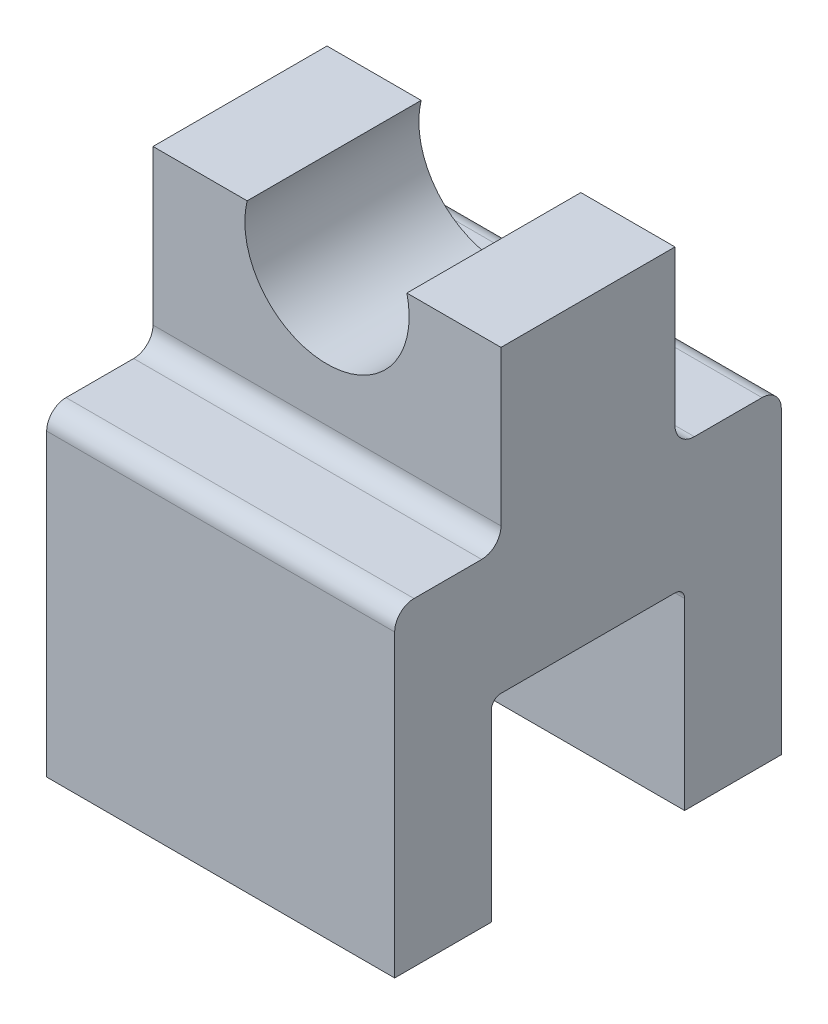
ISO-10303-21;
HEADER;
FILE_DESCRIPTION(('STEP AP214'),'2;1');
FILE_NAME('part.step','',(''),(''),'','','');
FILE_SCHEMA(('AUTOMOTIVE_DESIGN { 1 0 10303 214 1 1 1 1 }'));
ENDSEC;
DATA;
#1=APPLICATION_CONTEXT('core data for automotive mechanical design processes');
#2=APPLICATION_PROTOCOL_DEFINITION('international standard','automotive_design',2000,#1);
#3=PRODUCT_CONTEXT('',#1,'mechanical');
#4=PRODUCT('Part','Part','',(#3));
#5=PRODUCT_RELATED_PRODUCT_CATEGORY('part','',(#4));
#6=PRODUCT_DEFINITION_FORMATION('','',#4);
#7=PRODUCT_DEFINITION_CONTEXT('part definition',#1,'design');
#8=PRODUCT_DEFINITION('design','',#6,#7);
#9=PRODUCT_DEFINITION_SHAPE('','',#8);
#10=(LENGTH_UNIT() NAMED_UNIT(*) SI_UNIT(.MILLI.,.METRE.));
#11=(NAMED_UNIT(*) PLANE_ANGLE_UNIT() SI_UNIT($,.RADIAN.));
#12=(NAMED_UNIT(*) SI_UNIT($,.STERADIAN.) SOLID_ANGLE_UNIT());
#13=UNCERTAINTY_MEASURE_WITH_UNIT(LENGTH_MEASURE(1.E-05),#10,'distance_accuracy_value','');
#14=(GEOMETRIC_REPRESENTATION_CONTEXT(3) GLOBAL_UNCERTAINTY_ASSIGNED_CONTEXT((#13)) GLOBAL_UNIT_ASSIGNED_CONTEXT((#10,
#11,#12)) REPRESENTATION_CONTEXT('',''));
#15=CARTESIAN_POINT('',(0.,0.,0.));
#16=DIRECTION('',(0.,0.,1.));
#17=DIRECTION('',(1.,0.,0.));
#18=AXIS2_PLACEMENT_3D('',#15,#16,#17);
#19=CARTESIAN_POINT('',(0.,0.,50.8));
#20=DIRECTION('',(0.,1.,0.));
#21=DIRECTION('',(0.,0.,1.));
#22=AXIS2_PLACEMENT_3D('',#19,#20,#21);
#23=PLANE('',#22);
#24=DIRECTION('',(0.,0.,-1.));
#25=VECTOR('',#24,1.);
#26=CARTESIAN_POINT('',(0.,0.,50.8));
#27=LINE('',#26,#25);
#28=CARTESIAN_POINT('',(0.,0.,50.8));
#29=VERTEX_POINT('',#28);
#30=CARTESIAN_POINT('',(0.,0.,38.1));
#31=VERTEX_POINT('',#30);
#32=EDGE_CURVE('E226',#29,#31,#27,.T.);
#33=ORIENTED_EDGE('',*,*,#32,.T.);
#34=DIRECTION('',(1.,0.,0.));
#35=VECTOR('',#34,1.);
#36=CARTESIAN_POINT('',(0.,0.,38.1));
#37=LINE('',#36,#35);
#38=CARTESIAN_POINT('',(45.72,0.,38.1));
#39=VERTEX_POINT('',#38);
#40=EDGE_CURVE('E351',#31,#39,#37,.T.);
#41=ORIENTED_EDGE('',*,*,#40,.T.);
#42=DIRECTION('',(0.,0.,-1.));
#43=VECTOR('',#42,1.);
#44=CARTESIAN_POINT('',(45.72,0.,50.8));
#45=LINE('',#44,#43);
#46=CARTESIAN_POINT('',(45.72,0.,50.8));
#47=VERTEX_POINT('',#46);
#48=EDGE_CURVE('E217',#47,#39,#45,.T.);
#49=ORIENTED_EDGE('',*,*,#48,.F.);
#50=DIRECTION('',(1.,0.,0.));
#51=VECTOR('',#50,1.);
#52=CARTESIAN_POINT('',(0.,0.,50.8));
#53=LINE('',#52,#51);
#54=EDGE_CURVE('E371',#29,#47,#53,.T.);
#55=ORIENTED_EDGE('',*,*,#54,.F.);
#56=EDGE_LOOP('',(#33,#41,#49,#55));
#57=FACE_BOUND('',#56,.T.);
#58=ADVANCED_FACE('F45',(#57),#23,.F.);
#59=CARTESIAN_POINT('',(0.,0.,50.8));
#60=DIRECTION('',(1.,0.,0.));
#61=DIRECTION('',(0.,0.,-1.));
#62=AXIS2_PLACEMENT_3D('',#59,#60,#61);
#63=PLANE('',#62);
#64=DIRECTION('',(0.,0.,1.));
#65=VECTOR('',#64,1.);
#66=CARTESIAN_POINT('',(0.,41.91,0.));
#67=LINE('',#66,#65);
#68=CARTESIAN_POINT('',(0.,41.91,2.54));
#69=VERTEX_POINT('',#68);
#70=CARTESIAN_POINT('',(0.,41.91,11.43));
#71=VERTEX_POINT('',#70);
#72=EDGE_CURVE('E305',#69,#71,#67,.T.);
#73=ORIENTED_EDGE('',*,*,#72,.F.);
#74=CARTESIAN_POINT('',(0.,39.37,2.54));
#75=DIRECTION('',(1.,0.,0.));
#76=DIRECTION('',(0.,0.,-1.));
#77=AXIS2_PLACEMENT_3D('',#74,#75,#76);
#78=CIRCLE('',#77,2.54);
#79=CARTESIAN_POINT('',(0.,39.37,0.));
#80=VERTEX_POINT('',#79);
#81=EDGE_CURVE('E266',#69,#80,#78,.F.);
#82=ORIENTED_EDGE('',*,*,#81,.T.);
#83=DIRECTION('',(0.,-1.,0.));
#84=VECTOR('',#83,1.);
#85=CARTESIAN_POINT('',(0.,0.,0.));
#86=LINE('',#85,#84);
#87=CARTESIAN_POINT('',(0.,0.,0.));
#88=VERTEX_POINT('',#87);
#89=EDGE_CURVE('E364',#80,#88,#86,.T.);
#90=ORIENTED_EDGE('',*,*,#89,.T.);
#91=CARTESIAN_POINT('',(0.,0.,12.7));
#92=VERTEX_POINT('',#91);
#93=EDGE_CURVE('E225',#92,#88,#27,.T.);
#94=ORIENTED_EDGE('',*,*,#93,.F.);
#95=DIRECTION('',(0.,1.,0.));
#96=VECTOR('',#95,1.);
#97=CARTESIAN_POINT('',(0.,0.,12.7));
#98=LINE('',#97,#96);
#99=CARTESIAN_POINT('',(0.,24.13,12.7));
#100=VERTEX_POINT('',#99);
#101=EDGE_CURVE('E342',#92,#100,#98,.T.);
#102=ORIENTED_EDGE('',*,*,#101,.T.);
#103=CARTESIAN_POINT('',(0.,24.13,13.97));
#104=DIRECTION('',(1.,0.,0.));
#105=DIRECTION('',(0.,0.,-1.));
#106=AXIS2_PLACEMENT_3D('',#103,#104,#105);
#107=CIRCLE('',#106,1.27);
#108=CARTESIAN_POINT('',(0.,25.4,13.97));
#109=VERTEX_POINT('',#108);
#110=EDGE_CURVE('E253',#100,#109,#107,.T.);
#111=ORIENTED_EDGE('',*,*,#110,.T.);
#112=DIRECTION('',(0.,0.,1.));
#113=VECTOR('',#112,1.);
#114=CARTESIAN_POINT('',(0.,25.4,38.1));
#115=LINE('',#114,#113);
#116=CARTESIAN_POINT('',(0.,25.4,36.83));
#117=VERTEX_POINT('',#116);
#118=EDGE_CURVE('E347',#109,#117,#115,.T.);
#119=ORIENTED_EDGE('',*,*,#118,.T.);
#120=CARTESIAN_POINT('',(0.,24.13,36.83));
#121=DIRECTION('',(1.,0.,0.));
#122=DIRECTION('',(0.,0.,-1.));
#123=AXIS2_PLACEMENT_3D('',#120,#121,#122);
#124=CIRCLE('',#123,1.27);
#125=CARTESIAN_POINT('',(0.,24.13,38.1));
#126=VERTEX_POINT('',#125);
#127=EDGE_CURVE('E247',#117,#126,#124,.T.);
#128=ORIENTED_EDGE('',*,*,#127,.T.);
#129=DIRECTION('',(0.,-1.,0.));
#130=VECTOR('',#129,1.);
#131=CARTESIAN_POINT('',(0.,0.,38.1));
#132=LINE('',#131,#130);
#133=EDGE_CURVE('E339',#126,#31,#132,.T.);
#134=ORIENTED_EDGE('',*,*,#133,.T.);
#135=ORIENTED_EDGE('',*,*,#32,.F.);
#136=DIRECTION('',(0.,-1.,0.));
#137=VECTOR('',#136,1.);
#138=CARTESIAN_POINT('',(0.,0.,50.8));
#139=LINE('',#138,#137);
#140=CARTESIAN_POINT('',(0.,39.37,50.8));
#141=VERTEX_POINT('',#140);
#142=EDGE_CURVE('E368',#141,#29,#139,.T.);
#143=ORIENTED_EDGE('',*,*,#142,.F.);
#144=CARTESIAN_POINT('',(0.,39.37,48.26));
#145=DIRECTION('',(1.,0.,0.));
#146=DIRECTION('',(0.,0.,-1.));
#147=AXIS2_PLACEMENT_3D('',#144,#145,#146);
#148=CIRCLE('',#147,2.54);
#149=CARTESIAN_POINT('',(0.,41.91,48.26));
#150=VERTEX_POINT('',#149);
#151=EDGE_CURVE('E263',#141,#150,#148,.F.);
#152=ORIENTED_EDGE('',*,*,#151,.T.);
#153=DIRECTION('',(0.,0.,1.));
#154=VECTOR('',#153,1.);
#155=CARTESIAN_POINT('',(0.,41.91,50.8));
#156=LINE('',#155,#154);
#157=CARTESIAN_POINT('',(0.,41.91,39.37));
#158=VERTEX_POINT('',#157);
#159=EDGE_CURVE('E194',#158,#150,#156,.T.);
#160=ORIENTED_EDGE('',*,*,#159,.F.);
#161=CARTESIAN_POINT('',(0.,44.45,39.37));
#162=DIRECTION('',(1.,0.,0.));
#163=DIRECTION('',(0.,0.,-1.));
#164=AXIS2_PLACEMENT_3D('',#161,#162,#163);
#165=CIRCLE('',#164,2.54);
#166=CARTESIAN_POINT('',(0.,44.45,36.83));
#167=VERTEX_POINT('',#166);
#168=EDGE_CURVE('E294',#158,#167,#165,.T.);
#169=ORIENTED_EDGE('',*,*,#168,.T.);
#170=DIRECTION('',(0.,-1.,0.));
#171=VECTOR('',#170,1.);
#172=CARTESIAN_POINT('',(0.,64.77,36.83));
#173=LINE('',#172,#171);
#174=CARTESIAN_POINT('',(0.,64.77,36.83));
#175=VERTEX_POINT('',#174);
#176=EDGE_CURVE('E316',#175,#167,#173,.T.);
#177=ORIENTED_EDGE('',*,*,#176,.F.);
#178=DIRECTION('',(0.,0.,-1.));
#179=VECTOR('',#178,1.);
#180=CARTESIAN_POINT('',(0.,64.77,50.8));
#181=LINE('',#180,#179);
#182=CARTESIAN_POINT('',(0.,64.77,13.97));
#183=VERTEX_POINT('',#182);
#184=EDGE_CURVE('E378',#175,#183,#181,.T.);
#185=ORIENTED_EDGE('',*,*,#184,.T.);
#186=DIRECTION('',(0.,1.,0.));
#187=VECTOR('',#186,1.);
#188=CARTESIAN_POINT('',(0.,64.77,13.97));
#189=LINE('',#188,#187);
#190=CARTESIAN_POINT('',(0.,44.45,13.97));
#191=VERTEX_POINT('',#190);
#192=EDGE_CURVE('E307',#191,#183,#189,.T.);
#193=ORIENTED_EDGE('',*,*,#192,.F.);
#194=CARTESIAN_POINT('',(0.,44.45,11.43));
#195=DIRECTION('',(1.,0.,0.));
#196=DIRECTION('',(0.,0.,-1.));
#197=AXIS2_PLACEMENT_3D('',#194,#195,#196);
#198=CIRCLE('',#197,2.54);
#199=EDGE_CURVE('E54',#191,#71,#198,.T.);
#200=ORIENTED_EDGE('',*,*,#199,.T.);
#201=EDGE_LOOP('',(#73,#82,#90,#94,#102,#111,#119,#128,#134,#135,#143,#152,#160,#169,#177,#185,
#193,#200));
#202=FACE_BOUND('',#201,.T.);
#203=ADVANCED_FACE('F304',(#202),#63,.F.);
#204=CARTESIAN_POINT('',(45.72,0.,12.7));
#205=VERTEX_POINT('',#204);
#206=CARTESIAN_POINT('',(45.72,0.,0.));
#207=VERTEX_POINT('',#206);
#208=EDGE_CURVE('E213',#205,#207,#45,.T.);
#209=ORIENTED_EDGE('',*,*,#208,.F.);
#210=DIRECTION('',(1.,0.,0.));
#211=VECTOR('',#210,1.);
#212=CARTESIAN_POINT('',(0.,0.,12.7));
#213=LINE('',#212,#211);
#214=EDGE_CURVE('E361',#92,#205,#213,.T.);
#215=ORIENTED_EDGE('',*,*,#214,.F.);
#216=ORIENTED_EDGE('',*,*,#93,.T.);
#217=DIRECTION('',(1.,0.,0.));
#218=VECTOR('',#217,1.);
#219=CARTESIAN_POINT('',(0.,0.,0.));
#220=LINE('',#219,#218);
#221=EDGE_CURVE('E381',#88,#207,#220,.T.);
#222=ORIENTED_EDGE('',*,*,#221,.T.);
#223=EDGE_LOOP('',(#209,#215,#216,#222));
#224=FACE_BOUND('',#223,.T.);
#225=ADVANCED_FACE('F453',(#224),#23,.F.);
#226=CARTESIAN_POINT('',(45.72,0.,50.8));
#227=DIRECTION('',(-1.,0.,0.));
#228=DIRECTION('',(0.,0.,1.));
#229=AXIS2_PLACEMENT_3D('',#226,#227,#228);
#230=PLANE('',#229);
#231=DIRECTION('',(0.,1.,0.));
#232=VECTOR('',#231,1.);
#233=CARTESIAN_POINT('',(45.72,0.,0.));
#234=LINE('',#233,#232);
#235=CARTESIAN_POINT('',(45.72,39.37,0.));
#236=VERTEX_POINT('',#235);
#237=EDGE_CURVE('E372',#207,#236,#234,.T.);
#238=ORIENTED_EDGE('',*,*,#237,.T.);
#239=CARTESIAN_POINT('',(45.72,39.37,2.54));
#240=DIRECTION('',(-1.,0.,0.));
#241=DIRECTION('',(0.,0.,1.));
#242=AXIS2_PLACEMENT_3D('',#239,#240,#241);
#243=CIRCLE('',#242,2.54);
#244=CARTESIAN_POINT('',(45.72,41.91,2.54));
#245=VERTEX_POINT('',#244);
#246=EDGE_CURVE('E274',#236,#245,#243,.F.);
#247=ORIENTED_EDGE('',*,*,#246,.T.);
#248=DIRECTION('',(0.,0.,1.));
#249=VECTOR('',#248,1.);
#250=CARTESIAN_POINT('',(45.72,41.91,0.));
#251=LINE('',#250,#249);
#252=CARTESIAN_POINT('',(45.72,41.91,11.43));
#253=VERTEX_POINT('',#252);
#254=EDGE_CURVE('E323',#245,#253,#251,.T.);
#255=ORIENTED_EDGE('',*,*,#254,.T.);
#256=CARTESIAN_POINT('',(45.72,44.45,11.43));
#257=DIRECTION('',(-1.,0.,0.));
#258=DIRECTION('',(0.,0.,1.));
#259=AXIS2_PLACEMENT_3D('',#256,#257,#258);
#260=CIRCLE('',#259,2.54);
#261=CARTESIAN_POINT('',(45.72,44.45,13.97));
#262=VERTEX_POINT('',#261);
#263=EDGE_CURVE('E11',#253,#262,#260,.T.);
#264=ORIENTED_EDGE('',*,*,#263,.T.);
#265=DIRECTION('',(0.,1.,0.));
#266=VECTOR('',#265,1.);
#267=CARTESIAN_POINT('',(45.72,64.77,13.97));
#268=LINE('',#267,#266);
#269=CARTESIAN_POINT('',(45.72,64.77,13.97));
#270=VERTEX_POINT('',#269);
#271=EDGE_CURVE('E210',#262,#270,#268,.T.);
#272=ORIENTED_EDGE('',*,*,#271,.T.);
#273=DIRECTION('',(0.,0.,-1.));
#274=VECTOR('',#273,1.);
#275=CARTESIAN_POINT('',(45.72,64.77,50.8));
#276=LINE('',#275,#274);
#277=CARTESIAN_POINT('',(45.72,64.77,36.83));
#278=VERTEX_POINT('',#277);
#279=EDGE_CURVE('E201',#278,#270,#276,.T.);
#280=ORIENTED_EDGE('',*,*,#279,.F.);
#281=DIRECTION('',(0.,-1.,0.));
#282=VECTOR('',#281,1.);
#283=CARTESIAN_POINT('',(45.72,64.77,36.83));
#284=LINE('',#283,#282);
#285=CARTESIAN_POINT('',(45.72,44.45,36.83));
#286=VERTEX_POINT('',#285);
#287=EDGE_CURVE('E182',#278,#286,#284,.T.);
#288=ORIENTED_EDGE('',*,*,#287,.T.);
#289=CARTESIAN_POINT('',(45.72,44.45,39.37));
#290=DIRECTION('',(-1.,0.,0.));
#291=DIRECTION('',(0.,0.,1.));
#292=AXIS2_PLACEMENT_3D('',#289,#290,#291);
#293=CIRCLE('',#292,2.54);
#294=CARTESIAN_POINT('',(45.72,41.91,39.37));
#295=VERTEX_POINT('',#294);
#296=EDGE_CURVE('E297',#286,#295,#293,.T.);
#297=ORIENTED_EDGE('',*,*,#296,.T.);
#298=DIRECTION('',(0.,0.,1.));
#299=VECTOR('',#298,1.);
#300=CARTESIAN_POINT('',(45.72,41.91,50.8));
#301=LINE('',#300,#299);
#302=CARTESIAN_POINT('',(45.72,41.91,48.26));
#303=VERTEX_POINT('',#302);
#304=EDGE_CURVE('E193',#295,#303,#301,.T.);
#305=ORIENTED_EDGE('',*,*,#304,.T.);
#306=CARTESIAN_POINT('',(45.72,39.37,48.26));
#307=DIRECTION('',(-1.,0.,0.));
#308=DIRECTION('',(0.,0.,1.));
#309=AXIS2_PLACEMENT_3D('',#306,#307,#308);
#310=CIRCLE('',#309,2.54);
#311=CARTESIAN_POINT('',(45.72,39.37,50.8));
#312=VERTEX_POINT('',#311);
#313=EDGE_CURVE('E66',#303,#312,#310,.F.);
#314=ORIENTED_EDGE('',*,*,#313,.T.);
#315=DIRECTION('',(0.,1.,0.));
#316=VECTOR('',#315,1.);
#317=CARTESIAN_POINT('',(45.72,0.,50.8));
#318=LINE('',#317,#316);
#319=EDGE_CURVE('E375',#47,#312,#318,.T.);
#320=ORIENTED_EDGE('',*,*,#319,.F.);
#321=ORIENTED_EDGE('',*,*,#48,.T.);
#322=DIRECTION('',(0.,-1.,0.));
#323=VECTOR('',#322,1.);
#324=CARTESIAN_POINT('',(45.72,0.,38.1));
#325=LINE('',#324,#323);
#326=CARTESIAN_POINT('',(45.72,24.13,38.1));
#327=VERTEX_POINT('',#326);
#328=EDGE_CURVE('E338',#327,#39,#325,.T.);
#329=ORIENTED_EDGE('',*,*,#328,.F.);
#330=CARTESIAN_POINT('',(45.72,24.13,36.83));
#331=DIRECTION('',(-1.,0.,0.));
#332=DIRECTION('',(0.,0.,1.));
#333=AXIS2_PLACEMENT_3D('',#330,#331,#332);
#334=CIRCLE('',#333,1.27);
#335=CARTESIAN_POINT('',(45.72,25.4,36.83));
#336=VERTEX_POINT('',#335);
#337=EDGE_CURVE('E244',#327,#336,#334,.T.);
#338=ORIENTED_EDGE('',*,*,#337,.T.);
#339=DIRECTION('',(0.,0.,1.));
#340=VECTOR('',#339,1.);
#341=CARTESIAN_POINT('',(45.72,25.4,38.1));
#342=LINE('',#341,#340);
#343=CARTESIAN_POINT('',(45.72,25.4,13.97));
#344=VERTEX_POINT('',#343);
#345=EDGE_CURVE('E343',#344,#336,#342,.T.);
#346=ORIENTED_EDGE('',*,*,#345,.F.);
#347=CARTESIAN_POINT('',(45.72,24.13,13.97));
#348=DIRECTION('',(-1.,0.,0.));
#349=DIRECTION('',(0.,0.,1.));
#350=AXIS2_PLACEMENT_3D('',#347,#348,#349);
#351=CIRCLE('',#350,1.27);
#352=CARTESIAN_POINT('',(45.72,24.13,12.7));
#353=VERTEX_POINT('',#352);
#354=EDGE_CURVE('E250',#344,#353,#351,.T.);
#355=ORIENTED_EDGE('',*,*,#354,.T.);
#356=DIRECTION('',(0.,1.,0.));
#357=VECTOR('',#356,1.);
#358=CARTESIAN_POINT('',(45.72,0.,12.7));
#359=LINE('',#358,#357);
#360=EDGE_CURVE('E354',#205,#353,#359,.T.);
#361=ORIENTED_EDGE('',*,*,#360,.F.);
#362=ORIENTED_EDGE('',*,*,#208,.T.);
#363=EDGE_LOOP('',(#238,#247,#255,#264,#272,#280,#288,#297,#305,#314,#320,#321,#329,#338,#346,
#355,#361,#362));
#364=FACE_BOUND('',#363,.T.);
#365=ADVANCED_FACE('F209',(#364),#230,.F.);
#366=CARTESIAN_POINT('',(33.35192189258,64.77,50.8));
#367=DIRECTION('',(0.,-1.,0.));
#368=DIRECTION('',(0.,0.,-1.));
#369=AXIS2_PLACEMENT_3D('',#366,#367,#368);
#370=PLANE('',#369);
#371=DIRECTION('',(0.,0.,-1.));
#372=VECTOR('',#371,1.);
#373=CARTESIAN_POINT('',(33.35192189258,64.77,50.8));
#374=LINE('',#373,#372);
#375=CARTESIAN_POINT('',(33.35192189258,64.77,36.83));
#376=VERTEX_POINT('',#375);
#377=CARTESIAN_POINT('',(33.35192189258,64.77,13.97));
#378=VERTEX_POINT('',#377);
#379=EDGE_CURVE('E203',#376,#378,#374,.T.);
#380=ORIENTED_EDGE('',*,*,#379,.F.);
#381=DIRECTION('',(-1.,0.,0.));
#382=VECTOR('',#381,1.);
#383=CARTESIAN_POINT('',(45.72,64.77,36.83));
#384=LINE('',#383,#382);
#385=EDGE_CURVE('E186',#278,#376,#384,.T.);
#386=ORIENTED_EDGE('',*,*,#385,.F.);
#387=ORIENTED_EDGE('',*,*,#279,.T.);
#388=DIRECTION('',(-1.,0.,0.));
#389=VECTOR('',#388,1.);
#390=CARTESIAN_POINT('',(45.72,64.77,13.97));
#391=LINE('',#390,#389);
#392=EDGE_CURVE('E321',#270,#378,#391,.T.);
#393=ORIENTED_EDGE('',*,*,#392,.T.);
#394=EDGE_LOOP('',(#380,#386,#387,#393));
#395=FACE_BOUND('',#394,.T.);
#396=ADVANCED_FACE('F199',(#395),#370,.F.);
#397=CARTESIAN_POINT('',(22.86,62.23,50.8));
#398=DIRECTION('',(0.,0.,-1.));
#399=DIRECTION('',(-1.,0.,0.));
#400=AXIS2_PLACEMENT_3D('',#397,#398,#399);
#401=CYLINDRICAL_SURFACE('',#400,10.795);
#402=DIRECTION('',(0.,0.,-1.));
#403=VECTOR('',#402,1.);
#404=CARTESIAN_POINT('',(12.36807810742,64.77,50.8));
#405=LINE('',#404,#403);
#406=CARTESIAN_POINT('',(12.36807810742,64.77,36.83));
#407=VERTEX_POINT('',#406);
#408=CARTESIAN_POINT('',(12.36807810742,64.77,13.97));
#409=VERTEX_POINT('',#408);
#410=EDGE_CURVE('E219',#407,#409,#405,.T.);
#411=ORIENTED_EDGE('',*,*,#410,.F.);
#412=CARTESIAN_POINT('',(22.86,62.23,36.83));
#413=DIRECTION('',(0.,0.,-1.));
#414=DIRECTION('',(-1.,0.,0.));
#415=AXIS2_PLACEMENT_3D('',#412,#413,#414);
#416=CIRCLE('',#415,10.795);
#417=EDGE_CURVE('E335',#407,#376,#416,.F.);
#418=ORIENTED_EDGE('',*,*,#417,.T.);
#419=ORIENTED_EDGE('',*,*,#379,.T.);
#420=CARTESIAN_POINT('',(22.86,62.23,13.97));
#421=DIRECTION('',(0.,0.,1.));
#422=DIRECTION('',(0.,-1.,0.));
#423=AXIS2_PLACEMENT_3D('',#420,#421,#422);
#424=CIRCLE('',#423,10.795);
#425=EDGE_CURVE('E205',#378,#409,#424,.F.);
#426=ORIENTED_EDGE('',*,*,#425,.T.);
#427=EDGE_LOOP('',(#411,#418,#419,#426));
#428=FACE_BOUND('',#427,.T.);
#429=ADVANCED_FACE('F396',(#428),#401,.F.);
#430=CARTESIAN_POINT('',(0.,64.77,50.8));
#431=DIRECTION('',(0.,-1.,0.));
#432=DIRECTION('',(0.,0.,-1.));
#433=AXIS2_PLACEMENT_3D('',#430,#431,#432);
#434=PLANE('',#433);
#435=ORIENTED_EDGE('',*,*,#184,.F.);
#436=EDGE_CURVE('E206',#407,#175,#384,.T.);
#437=ORIENTED_EDGE('',*,*,#436,.F.);
#438=ORIENTED_EDGE('',*,*,#410,.T.);
#439=EDGE_CURVE('E328',#409,#183,#391,.T.);
#440=ORIENTED_EDGE('',*,*,#439,.T.);
#441=EDGE_LOOP('',(#435,#437,#438,#440));
#442=FACE_BOUND('',#441,.T.);
#443=ADVANCED_FACE('F394',(#442),#434,.F.);
#444=CARTESIAN_POINT('',(22.86,62.23,50.8));
#445=DIRECTION('',(0.,0.,1.));
#446=DIRECTION('',(1.,0.,0.));
#447=AXIS2_PLACEMENT_3D('',#444,#445,#446);
#448=PLANE('',#447);
#449=ORIENTED_EDGE('',*,*,#319,.T.);
#450=DIRECTION('',(-1.,0.,0.));
#451=VECTOR('',#450,1.);
#452=CARTESIAN_POINT('',(0.,39.37,50.8));
#453=LINE('',#452,#451);
#454=EDGE_CURVE('E277',#312,#141,#453,.T.);
#455=ORIENTED_EDGE('',*,*,#454,.T.);
#456=ORIENTED_EDGE('',*,*,#142,.T.);
#457=ORIENTED_EDGE('',*,*,#54,.T.);
#458=EDGE_LOOP('',(#449,#455,#456,#457));
#459=FACE_BOUND('',#458,.T.);
#460=ADVANCED_FACE('F421',(#459),#448,.T.);
#461=CARTESIAN_POINT('',(22.86,62.23,0.));
#462=DIRECTION('',(0.,0.,1.));
#463=DIRECTION('',(1.,0.,0.));
#464=AXIS2_PLACEMENT_3D('',#461,#462,#463);
#465=PLANE('',#464);
#466=ORIENTED_EDGE('',*,*,#89,.F.);
#467=DIRECTION('',(-1.,0.,0.));
#468=VECTOR('',#467,1.);
#469=CARTESIAN_POINT('',(22.86,39.37,0.));
#470=LINE('',#469,#468);
#471=EDGE_CURVE('E269',#80,#236,#470,.F.);
#472=ORIENTED_EDGE('',*,*,#471,.T.);
#473=ORIENTED_EDGE('',*,*,#237,.F.);
#474=ORIENTED_EDGE('',*,*,#221,.F.);
#475=EDGE_LOOP('',(#466,#472,#473,#474));
#476=FACE_BOUND('',#475,.T.);
#477=ADVANCED_FACE('F459',(#476),#465,.F.);
#478=CARTESIAN_POINT('',(0.,0.,38.1));
#479=DIRECTION('',(0.,0.,1.));
#480=DIRECTION('',(1.,0.,0.));
#481=AXIS2_PLACEMENT_3D('',#478,#479,#480);
#482=PLANE('',#481);
#483=ORIENTED_EDGE('',*,*,#133,.F.);
#484=DIRECTION('',(1.,0.,0.));
#485=VECTOR('',#484,1.);
#486=CARTESIAN_POINT('',(45.72,24.13,38.1));
#487=LINE('',#486,#485);
#488=EDGE_CURVE('E230',#126,#327,#487,.T.);
#489=ORIENTED_EDGE('',*,*,#488,.T.);
#490=ORIENTED_EDGE('',*,*,#328,.T.);
#491=ORIENTED_EDGE('',*,*,#40,.F.);
#492=EDGE_LOOP('',(#483,#489,#490,#491));
#493=FACE_BOUND('',#492,.T.);
#494=ADVANCED_FACE('F431',(#493),#482,.F.);
#495=CARTESIAN_POINT('',(0.,25.4,38.1));
#496=DIRECTION('',(0.,1.,0.));
#497=DIRECTION('',(0.,0.,1.));
#498=AXIS2_PLACEMENT_3D('',#495,#496,#497);
#499=PLANE('',#498);
#500=ORIENTED_EDGE('',*,*,#345,.T.);
#501=DIRECTION('',(1.,0.,0.));
#502=VECTOR('',#501,1.);
#503=CARTESIAN_POINT('',(0.,25.4,36.83));
#504=LINE('',#503,#502);
#505=EDGE_CURVE('E238',#336,#117,#504,.F.);
#506=ORIENTED_EDGE('',*,*,#505,.T.);
#507=ORIENTED_EDGE('',*,*,#118,.F.);
#508=DIRECTION('',(1.,0.,0.));
#509=VECTOR('',#508,1.);
#510=CARTESIAN_POINT('',(45.72,25.4,13.97));
#511=LINE('',#510,#509);
#512=EDGE_CURVE('E234',#109,#344,#511,.T.);
#513=ORIENTED_EDGE('',*,*,#512,.T.);
#514=EDGE_LOOP('',(#500,#506,#507,#513));
#515=FACE_BOUND('',#514,.T.);
#516=ADVANCED_FACE('F439',(#515),#499,.F.);
#517=CARTESIAN_POINT('',(0.,0.,12.7));
#518=DIRECTION('',(0.,0.,-1.));
#519=DIRECTION('',(-1.,0.,0.));
#520=AXIS2_PLACEMENT_3D('',#517,#518,#519);
#521=PLANE('',#520);
#522=ORIENTED_EDGE('',*,*,#360,.T.);
#523=DIRECTION('',(1.,0.,0.));
#524=VECTOR('',#523,1.);
#525=CARTESIAN_POINT('',(0.,24.13,12.7));
#526=LINE('',#525,#524);
#527=EDGE_CURVE('E241',#353,#100,#526,.F.);
#528=ORIENTED_EDGE('',*,*,#527,.T.);
#529=ORIENTED_EDGE('',*,*,#101,.F.);
#530=ORIENTED_EDGE('',*,*,#214,.T.);
#531=EDGE_LOOP('',(#522,#528,#529,#530));
#532=FACE_BOUND('',#531,.T.);
#533=ADVANCED_FACE('F449',(#532),#521,.F.);
#534=CARTESIAN_POINT('',(0.,24.13,36.83));
#535=DIRECTION('',(-1.,0.,0.));
#536=DIRECTION('',(0.,0.,1.));
#537=AXIS2_PLACEMENT_3D('',#534,#535,#536);
#538=CYLINDRICAL_SURFACE('',#537,1.27);
#539=ORIENTED_EDGE('',*,*,#127,.F.);
#540=ORIENTED_EDGE('',*,*,#505,.F.);
#541=ORIENTED_EDGE('',*,*,#337,.F.);
#542=ORIENTED_EDGE('',*,*,#488,.F.);
#543=EDGE_LOOP('',(#539,#540,#541,#542));
#544=FACE_BOUND('',#543,.T.);
#545=ADVANCED_FACE('F435',(#544),#538,.F.);
#546=CARTESIAN_POINT('',(0.,24.13,13.97));
#547=DIRECTION('',(-1.,0.,0.));
#548=DIRECTION('',(0.,0.,1.));
#549=AXIS2_PLACEMENT_3D('',#546,#547,#548);
#550=CYLINDRICAL_SURFACE('',#549,1.27);
#551=ORIENTED_EDGE('',*,*,#110,.F.);
#552=ORIENTED_EDGE('',*,*,#527,.F.);
#553=ORIENTED_EDGE('',*,*,#354,.F.);
#554=ORIENTED_EDGE('',*,*,#512,.F.);
#555=EDGE_LOOP('',(#551,#552,#553,#554));
#556=FACE_BOUND('',#555,.T.);
#557=ADVANCED_FACE('F445',(#556),#550,.F.);
#558=CARTESIAN_POINT('',(45.72,64.77,13.97));
#559=DIRECTION('',(0.,0.,1.));
#560=DIRECTION('',(0.,-1.,0.));
#561=AXIS2_PLACEMENT_3D('',#558,#559,#560);
#562=PLANE('',#561);
#563=ORIENTED_EDGE('',*,*,#271,.F.);
#564=DIRECTION('',(-1.,0.,0.));
#565=VECTOR('',#564,1.);
#566=CARTESIAN_POINT('',(0.,44.45,13.97));
#567=LINE('',#566,#565);
#568=EDGE_CURVE('E290',#262,#191,#567,.T.);
#569=ORIENTED_EDGE('',*,*,#568,.T.);
#570=ORIENTED_EDGE('',*,*,#192,.T.);
#571=ORIENTED_EDGE('',*,*,#439,.F.);
#572=ORIENTED_EDGE('',*,*,#425,.F.);
#573=ORIENTED_EDGE('',*,*,#392,.F.);
#574=EDGE_LOOP('',(#563,#569,#570,#571,#572,#573));
#575=FACE_BOUND('',#574,.T.);
#576=ADVANCED_FACE('F319',(#575),#562,.F.);
#577=CARTESIAN_POINT('',(45.72,41.91,0.));
#578=DIRECTION('',(0.,-1.,0.));
#579=DIRECTION('',(0.,0.,-1.));
#580=AXIS2_PLACEMENT_3D('',#577,#578,#579);
#581=PLANE('',#580);
#582=ORIENTED_EDGE('',*,*,#254,.F.);
#583=DIRECTION('',(-1.,0.,0.));
#584=VECTOR('',#583,1.);
#585=CARTESIAN_POINT('',(45.72,41.91,2.54));
#586=LINE('',#585,#584);
#587=EDGE_CURVE('E259',#245,#69,#586,.T.);
#588=ORIENTED_EDGE('',*,*,#587,.T.);
#589=ORIENTED_EDGE('',*,*,#72,.T.);
#590=DIRECTION('',(-1.,0.,0.));
#591=VECTOR('',#590,1.);
#592=CARTESIAN_POINT('',(45.72,41.91,11.43));
#593=LINE('',#592,#591);
#594=EDGE_CURVE('E256',#71,#253,#593,.F.);
#595=ORIENTED_EDGE('',*,*,#594,.T.);
#596=EDGE_LOOP('',(#582,#588,#589,#595));
#597=FACE_BOUND('',#596,.T.);
#598=ADVANCED_FACE('F313',(#597),#581,.F.);
#599=CARTESIAN_POINT('',(45.72,64.77,36.83));
#600=DIRECTION('',(0.,0.,-1.));
#601=DIRECTION('',(-1.,0.,0.));
#602=AXIS2_PLACEMENT_3D('',#599,#600,#601);
#603=PLANE('',#602);
#604=ORIENTED_EDGE('',*,*,#176,.T.);
#605=DIRECTION('',(-1.,0.,0.));
#606=VECTOR('',#605,1.);
#607=CARTESIAN_POINT('',(45.72,44.45,36.83));
#608=LINE('',#607,#606);
#609=EDGE_CURVE('E189',#167,#286,#608,.F.);
#610=ORIENTED_EDGE('',*,*,#609,.T.);
#611=ORIENTED_EDGE('',*,*,#287,.F.);
#612=ORIENTED_EDGE('',*,*,#385,.T.);
#613=ORIENTED_EDGE('',*,*,#417,.F.);
#614=ORIENTED_EDGE('',*,*,#436,.T.);
#615=EDGE_LOOP('',(#604,#610,#611,#612,#613,#614));
#616=FACE_BOUND('',#615,.T.);
#617=ADVANCED_FACE('F185',(#616),#603,.F.);
#618=CARTESIAN_POINT('',(45.72,41.91,50.8));
#619=DIRECTION('',(0.,-1.,0.));
#620=DIRECTION('',(0.,0.,-1.));
#621=AXIS2_PLACEMENT_3D('',#618,#619,#620);
#622=PLANE('',#621);
#623=ORIENTED_EDGE('',*,*,#159,.T.);
#624=DIRECTION('',(-1.,0.,0.));
#625=VECTOR('',#624,1.);
#626=CARTESIAN_POINT('',(45.72,41.91,48.26));
#627=LINE('',#626,#625);
#628=EDGE_CURVE('E285',#150,#303,#627,.F.);
#629=ORIENTED_EDGE('',*,*,#628,.T.);
#630=ORIENTED_EDGE('',*,*,#304,.F.);
#631=DIRECTION('',(-1.,0.,0.));
#632=VECTOR('',#631,1.);
#633=CARTESIAN_POINT('',(0.,41.91,39.37));
#634=LINE('',#633,#632);
#635=EDGE_CURVE('E281',#295,#158,#634,.T.);
#636=ORIENTED_EDGE('',*,*,#635,.T.);
#637=EDGE_LOOP('',(#623,#629,#630,#636));
#638=FACE_BOUND('',#637,.T.);
#639=ADVANCED_FACE('F414',(#638),#622,.F.);
#640=CARTESIAN_POINT('',(45.72,39.37,2.54));
#641=DIRECTION('',(-1.,0.,0.));
#642=DIRECTION('',(0.,0.,1.));
#643=AXIS2_PLACEMENT_3D('',#640,#641,#642);
#644=CYLINDRICAL_SURFACE('',#643,2.54);
#645=ORIENTED_EDGE('',*,*,#246,.F.);
#646=ORIENTED_EDGE('',*,*,#471,.F.);
#647=ORIENTED_EDGE('',*,*,#81,.F.);
#648=ORIENTED_EDGE('',*,*,#587,.F.);
#649=EDGE_LOOP('',(#645,#646,#647,#648));
#650=FACE_BOUND('',#649,.T.);
#651=ADVANCED_FACE('F463',(#650),#644,.T.);
#652=CARTESIAN_POINT('',(22.86,39.37,48.26));
#653=DIRECTION('',(1.,0.,0.));
#654=DIRECTION('',(0.,0.,-1.));
#655=AXIS2_PLACEMENT_3D('',#652,#653,#654);
#656=CYLINDRICAL_SURFACE('',#655,2.54);
#657=ORIENTED_EDGE('',*,*,#313,.F.);
#658=ORIENTED_EDGE('',*,*,#628,.F.);
#659=ORIENTED_EDGE('',*,*,#151,.F.);
#660=ORIENTED_EDGE('',*,*,#454,.F.);
#661=EDGE_LOOP('',(#657,#658,#659,#660));
#662=FACE_BOUND('',#661,.T.);
#663=ADVANCED_FACE('F418',(#662),#656,.T.);
#664=CARTESIAN_POINT('',(45.72,44.45,39.37));
#665=DIRECTION('',(1.,0.,0.));
#666=DIRECTION('',(0.,0.,-1.));
#667=AXIS2_PLACEMENT_3D('',#664,#665,#666);
#668=CYLINDRICAL_SURFACE('',#667,2.54);
#669=ORIENTED_EDGE('',*,*,#296,.F.);
#670=ORIENTED_EDGE('',*,*,#609,.F.);
#671=ORIENTED_EDGE('',*,*,#168,.F.);
#672=ORIENTED_EDGE('',*,*,#635,.F.);
#673=EDGE_LOOP('',(#669,#670,#671,#672));
#674=FACE_BOUND('',#673,.T.);
#675=ADVANCED_FACE('F411',(#674),#668,.F.);
#676=CARTESIAN_POINT('',(45.72,44.45,11.43));
#677=DIRECTION('',(1.,0.,0.));
#678=DIRECTION('',(0.,0.,-1.));
#679=AXIS2_PLACEMENT_3D('',#676,#677,#678);
#680=CYLINDRICAL_SURFACE('',#679,2.54);
#681=ORIENTED_EDGE('',*,*,#263,.F.);
#682=ORIENTED_EDGE('',*,*,#594,.F.);
#683=ORIENTED_EDGE('',*,*,#199,.F.);
#684=ORIENTED_EDGE('',*,*,#568,.F.);
#685=EDGE_LOOP('',(#681,#682,#683,#684));
#686=FACE_BOUND('',#685,.T.);
#687=ADVANCED_FACE('F47',(#686),#680,.F.);
#688=CLOSED_SHELL('',(#58,#203,#225,#365,#396,#429,#443,#460,#477,#494,#516,#533,#545,#557,#576,
#598,#617,#639,#651,#663,#675,#687));
#689=MANIFOLD_SOLID_BREP('B2',#688);
#690=ADVANCED_BREP_SHAPE_REPRESENTATION('',(#18,#689),#14);
#691=SHAPE_DEFINITION_REPRESENTATION(#9,#690);
ENDSEC;
END-ISO-10303-21;
